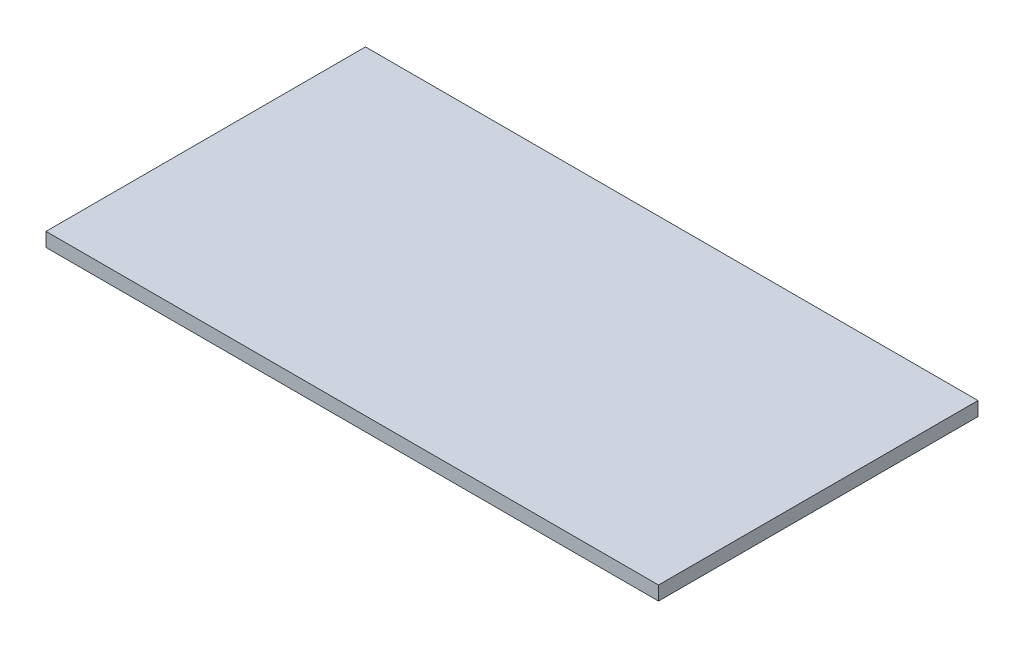
ISO-10303-21;
HEADER;
FILE_DESCRIPTION(('STEP AP214'),'2;1');
FILE_NAME('part.step','',(''),(''),'','','');
FILE_SCHEMA(('AUTOMOTIVE_DESIGN { 1 0 10303 214 1 1 1 1 }'));
ENDSEC;
DATA;
#1=APPLICATION_CONTEXT('core data for automotive mechanical design processes');
#2=APPLICATION_PROTOCOL_DEFINITION('international standard','automotive_design',2000,#1);
#3=PRODUCT_CONTEXT('',#1,'mechanical');
#4=PRODUCT('Part','Part','',(#3));
#5=PRODUCT_RELATED_PRODUCT_CATEGORY('part','',(#4));
#6=PRODUCT_DEFINITION_FORMATION('','',#4);
#7=PRODUCT_DEFINITION_CONTEXT('part definition',#1,'design');
#8=PRODUCT_DEFINITION('design','',#6,#7);
#9=PRODUCT_DEFINITION_SHAPE('','',#8);
#10=(LENGTH_UNIT() NAMED_UNIT(*) SI_UNIT(.MILLI.,.METRE.));
#11=(NAMED_UNIT(*) PLANE_ANGLE_UNIT() SI_UNIT($,.RADIAN.));
#12=(NAMED_UNIT(*) SI_UNIT($,.STERADIAN.) SOLID_ANGLE_UNIT());
#13=UNCERTAINTY_MEASURE_WITH_UNIT(LENGTH_MEASURE(1.E-05),#10,'distance_accuracy_value','');
#14=(GEOMETRIC_REPRESENTATION_CONTEXT(3) GLOBAL_UNCERTAINTY_ASSIGNED_CONTEXT((#13)) GLOBAL_UNIT_ASSIGNED_CONTEXT((#10,
#11,#12)) REPRESENTATION_CONTEXT('',''));
#15=CARTESIAN_POINT('',(0.,0.,0.));
#16=DIRECTION('',(0.,0.,1.));
#17=DIRECTION('',(1.,0.,0.));
#18=AXIS2_PLACEMENT_3D('',#15,#16,#17);
#19=CARTESIAN_POINT('',(-55.744677001196,2.54,29.0766988061794));
#20=DIRECTION('',(1.,0.,0.));
#21=DIRECTION('',(0.,0.,-1.));
#22=AXIS2_PLACEMENT_3D('',#19,#20,#21);
#23=PLANE('',#22);
#24=DIRECTION('',(0.,0.,1.));
#25=VECTOR('',#24,1.);
#26=CARTESIAN_POINT('',(-55.744677001196,0.,29.0766988061794));
#27=LINE('',#26,#25);
#28=CARTESIAN_POINT('',(-55.744677001196,0.,-29.0766988061794));
#29=VERTEX_POINT('',#28);
#30=CARTESIAN_POINT('',(-55.744677001196,0.,29.0766988061794));
#31=VERTEX_POINT('',#30);
#32=EDGE_CURVE('E96',#29,#31,#27,.T.);
#33=ORIENTED_EDGE('',*,*,#32,.T.);
#34=DIRECTION('',(0.,-1.,0.));
#35=VECTOR('',#34,1.);
#36=CARTESIAN_POINT('',(-55.744677001196,2.54,29.0766988061794));
#37=LINE('',#36,#35);
#38=CARTESIAN_POINT('',(-55.744677001196,2.54,29.0766988061794));
#39=VERTEX_POINT('',#38);
#40=EDGE_CURVE('E11',#39,#31,#37,.T.);
#41=ORIENTED_EDGE('',*,*,#40,.F.);
#42=DIRECTION('',(0.,0.,1.));
#43=VECTOR('',#42,1.);
#44=CARTESIAN_POINT('',(-55.744677001196,2.54,29.0766988061794));
#45=LINE('',#44,#43);
#46=CARTESIAN_POINT('',(-55.744677001196,2.54,-29.0766988061794));
#47=VERTEX_POINT('',#46);
#48=EDGE_CURVE('E84',#47,#39,#45,.T.);
#49=ORIENTED_EDGE('',*,*,#48,.F.);
#50=DIRECTION('',(0.,-1.,0.));
#51=VECTOR('',#50,1.);
#52=CARTESIAN_POINT('',(-55.744677001196,2.54,-29.0766988061794));
#53=LINE('',#52,#51);
#54=EDGE_CURVE('E92',#47,#29,#53,.T.);
#55=ORIENTED_EDGE('',*,*,#54,.T.);
#56=EDGE_LOOP('',(#33,#41,#49,#55));
#57=FACE_BOUND('',#56,.T.);
#58=ADVANCED_FACE('F33',(#57),#23,.F.);
#59=CARTESIAN_POINT('',(55.744677001196,2.54,29.0766988061794));
#60=DIRECTION('',(0.,0.,-1.));
#61=DIRECTION('',(-1.,0.,0.));
#62=AXIS2_PLACEMENT_3D('',#59,#60,#61);
#63=PLANE('',#62);
#64=DIRECTION('',(1.,0.,0.));
#65=VECTOR('',#64,1.);
#66=CARTESIAN_POINT('',(55.744677001196,0.,29.0766988061794));
#67=LINE('',#66,#65);
#68=CARTESIAN_POINT('',(55.744677001196,0.,29.0766988061794));
#69=VERTEX_POINT('',#68);
#70=EDGE_CURVE('E88',#31,#69,#67,.T.);
#71=ORIENTED_EDGE('',*,*,#70,.T.);
#72=DIRECTION('',(0.,-1.,0.));
#73=VECTOR('',#72,1.);
#74=CARTESIAN_POINT('',(55.744677001196,2.54,29.0766988061794));
#75=LINE('',#74,#73);
#76=CARTESIAN_POINT('',(55.744677001196,2.54,29.0766988061794));
#77=VERTEX_POINT('',#76);
#78=EDGE_CURVE('E41',#77,#69,#75,.T.);
#79=ORIENTED_EDGE('',*,*,#78,.F.);
#80=DIRECTION('',(1.,0.,0.));
#81=VECTOR('',#80,1.);
#82=CARTESIAN_POINT('',(55.744677001196,2.54,29.0766988061794));
#83=LINE('',#82,#81);
#84=EDGE_CURVE('E79',#39,#77,#83,.T.);
#85=ORIENTED_EDGE('',*,*,#84,.F.);
#86=ORIENTED_EDGE('',*,*,#40,.T.);
#87=EDGE_LOOP('',(#71,#79,#85,#86));
#88=FACE_BOUND('',#87,.T.);
#89=ADVANCED_FACE('F87',(#88),#63,.F.);
#90=CARTESIAN_POINT('',(55.744677001196,2.54,29.0766988061794));
#91=DIRECTION('',(-1.,0.,0.));
#92=DIRECTION('',(0.,0.,1.));
#93=AXIS2_PLACEMENT_3D('',#90,#91,#92);
#94=PLANE('',#93);
#95=DIRECTION('',(0.,0.,-1.));
#96=VECTOR('',#95,1.);
#97=CARTESIAN_POINT('',(55.744677001196,0.,29.0766988061794));
#98=LINE('',#97,#96);
#99=CARTESIAN_POINT('',(55.744677001196,0.,-29.0766988061794));
#100=VERTEX_POINT('',#99);
#101=EDGE_CURVE('E66',#69,#100,#98,.T.);
#102=ORIENTED_EDGE('',*,*,#101,.T.);
#103=DIRECTION('',(0.,-1.,0.));
#104=VECTOR('',#103,1.);
#105=CARTESIAN_POINT('',(55.744677001196,2.54,-29.0766988061794));
#106=LINE('',#105,#104);
#107=CARTESIAN_POINT('',(55.744677001196,2.54,-29.0766988061794));
#108=VERTEX_POINT('',#107);
#109=EDGE_CURVE('E89',#108,#100,#106,.T.);
#110=ORIENTED_EDGE('',*,*,#109,.F.);
#111=DIRECTION('',(0.,0.,-1.));
#112=VECTOR('',#111,1.);
#113=CARTESIAN_POINT('',(55.744677001196,2.54,29.0766988061794));
#114=LINE('',#113,#112);
#115=EDGE_CURVE('E82',#77,#108,#114,.T.);
#116=ORIENTED_EDGE('',*,*,#115,.F.);
#117=ORIENTED_EDGE('',*,*,#78,.T.);
#118=EDGE_LOOP('',(#102,#110,#116,#117));
#119=FACE_BOUND('',#118,.T.);
#120=ADVANCED_FACE('F90',(#119),#94,.F.);
#121=CARTESIAN_POINT('',(55.744677001196,2.54,-29.0766988061794));
#122=DIRECTION('',(0.,0.,1.));
#123=DIRECTION('',(1.,0.,0.));
#124=AXIS2_PLACEMENT_3D('',#121,#122,#123);
#125=PLANE('',#124);
#126=DIRECTION('',(-1.,0.,0.));
#127=VECTOR('',#126,1.);
#128=CARTESIAN_POINT('',(55.744677001196,0.,-29.0766988061794));
#129=LINE('',#128,#127);
#130=EDGE_CURVE('E72',#100,#29,#129,.T.);
#131=ORIENTED_EDGE('',*,*,#130,.T.);
#132=ORIENTED_EDGE('',*,*,#54,.F.);
#133=DIRECTION('',(-1.,0.,0.));
#134=VECTOR('',#133,1.);
#135=CARTESIAN_POINT('',(55.744677001196,2.54,-29.0766988061794));
#136=LINE('',#135,#134);
#137=EDGE_CURVE('E49',#108,#47,#136,.T.);
#138=ORIENTED_EDGE('',*,*,#137,.F.);
#139=ORIENTED_EDGE('',*,*,#109,.T.);
#140=EDGE_LOOP('',(#131,#132,#138,#139));
#141=FACE_BOUND('',#140,.T.);
#142=ADVANCED_FACE('F103',(#141),#125,.F.);
#143=CARTESIAN_POINT('',(0.,2.54,0.));
#144=DIRECTION('',(0.,1.,0.));
#145=DIRECTION('',(0.,0.,1.));
#146=AXIS2_PLACEMENT_3D('',#143,#144,#145);
#147=PLANE('',#146);
#148=ORIENTED_EDGE('',*,*,#48,.T.);
#149=ORIENTED_EDGE('',*,*,#84,.T.);
#150=ORIENTED_EDGE('',*,*,#115,.T.);
#151=ORIENTED_EDGE('',*,*,#137,.T.);
#152=EDGE_LOOP('',(#148,#149,#150,#151));
#153=FACE_BOUND('',#152,.T.);
#154=ADVANCED_FACE('F80',(#153),#147,.T.);
#155=CARTESIAN_POINT('',(0.,0.,0.));
#156=DIRECTION('',(0.,1.,0.));
#157=DIRECTION('',(0.,0.,1.));
#158=AXIS2_PLACEMENT_3D('',#155,#156,#157);
#159=PLANE('',#158);
#160=ORIENTED_EDGE('',*,*,#32,.F.);
#161=ORIENTED_EDGE('',*,*,#130,.F.);
#162=ORIENTED_EDGE('',*,*,#101,.F.);
#163=ORIENTED_EDGE('',*,*,#70,.F.);
#164=EDGE_LOOP('',(#160,#161,#162,#163));
#165=FACE_BOUND('',#164,.T.);
#166=ADVANCED_FACE('F106',(#165),#159,.F.);
#167=CLOSED_SHELL('',(#58,#89,#120,#142,#154,#166));
#168=MANIFOLD_SOLID_BREP('B2',#167);
#169=ADVANCED_BREP_SHAPE_REPRESENTATION('',(#18,#168),#14);
#170=SHAPE_DEFINITION_REPRESENTATION(#9,#169);
ENDSEC;
END-ISO-10303-21;
